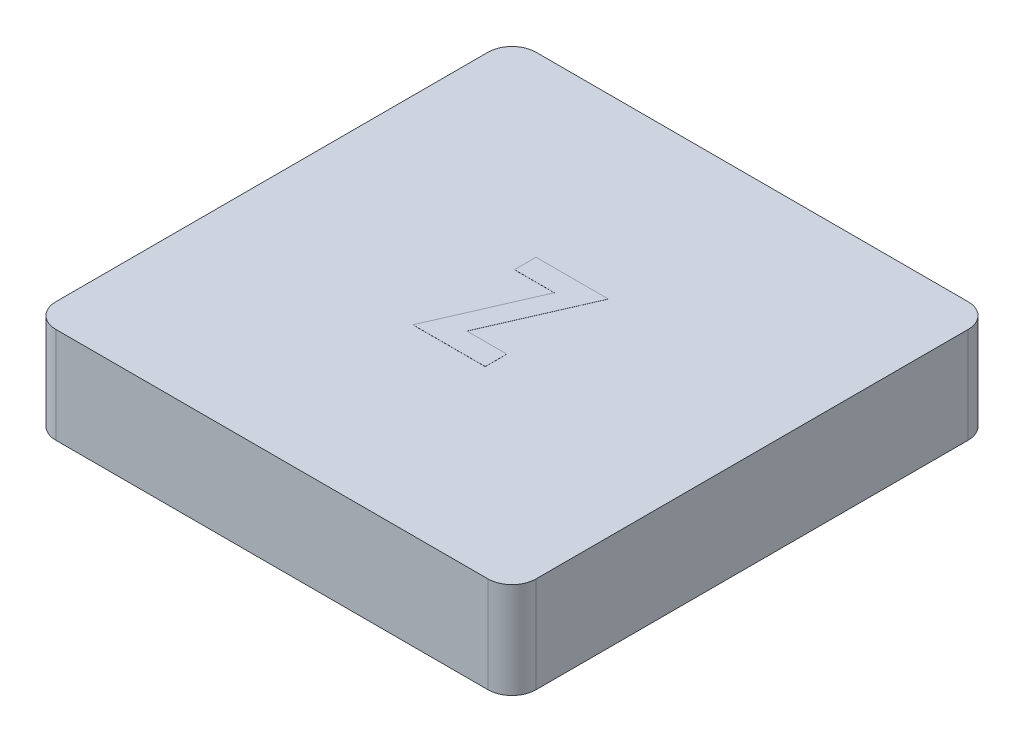
ISO-10303-21;
HEADER;
FILE_DESCRIPTION(('STEP AP214'),'2;1');
FILE_NAME('part.step','',(''),(''),'','','');
FILE_SCHEMA(('AUTOMOTIVE_DESIGN { 1 0 10303 214 1 1 1 1 }'));
ENDSEC;
DATA;
#1=APPLICATION_CONTEXT('core data for automotive mechanical design processes');
#2=APPLICATION_PROTOCOL_DEFINITION('international standard','automotive_design',2000,#1);
#3=PRODUCT_CONTEXT('',#1,'mechanical');
#4=PRODUCT('Part','Part','',(#3));
#5=PRODUCT_RELATED_PRODUCT_CATEGORY('part','',(#4));
#6=PRODUCT_DEFINITION_FORMATION('','',#4);
#7=PRODUCT_DEFINITION_CONTEXT('part definition',#1,'design');
#8=PRODUCT_DEFINITION('design','',#6,#7);
#9=PRODUCT_DEFINITION_SHAPE('','',#8);
#10=(LENGTH_UNIT() NAMED_UNIT(*) SI_UNIT(.MILLI.,.METRE.));
#11=(NAMED_UNIT(*) PLANE_ANGLE_UNIT() SI_UNIT($,.RADIAN.));
#12=(NAMED_UNIT(*) SI_UNIT($,.STERADIAN.) SOLID_ANGLE_UNIT());
#13=UNCERTAINTY_MEASURE_WITH_UNIT(LENGTH_MEASURE(1.E-05),#10,'distance_accuracy_value','');
#14=(GEOMETRIC_REPRESENTATION_CONTEXT(3) GLOBAL_UNCERTAINTY_ASSIGNED_CONTEXT((#13)) GLOBAL_UNIT_ASSIGNED_CONTEXT((#10,
#11,#12)) REPRESENTATION_CONTEXT('',''));
#15=CARTESIAN_POINT('',(0.,0.,0.));
#16=DIRECTION('',(0.,0.,1.));
#17=DIRECTION('',(1.,0.,0.));
#18=AXIS2_PLACEMENT_3D('',#15,#16,#17);
#19=CARTESIAN_POINT('',(0.,2.54,-12.7));
#20=DIRECTION('',(1.,0.,0.));
#21=DIRECTION('',(0.,0.,-1.));
#22=AXIS2_PLACEMENT_3D('',#19,#20,#21);
#23=PLANE('',#22);
#24=DIRECTION('',(0.,0.,1.));
#25=VECTOR('',#24,1.);
#26=CARTESIAN_POINT('',(0.,2.54,-12.7));
#27=LINE('',#26,#25);
#28=CARTESIAN_POINT('',(0.,2.54,-12.065));
#29=VERTEX_POINT('',#28);
#30=CARTESIAN_POINT('',(0.,2.54,-0.635));
#31=VERTEX_POINT('',#30);
#32=EDGE_CURVE('E280',#29,#31,#27,.T.);
#33=ORIENTED_EDGE('',*,*,#32,.F.);
#34=DIRECTION('',(0.,-1.,0.));
#35=VECTOR('',#34,1.);
#36=CARTESIAN_POINT('',(0.,2.54,-12.065));
#37=LINE('',#36,#35);
#38=CARTESIAN_POINT('',(0.,0.,-12.065));
#39=VERTEX_POINT('',#38);
#40=EDGE_CURVE('E305',#29,#39,#37,.T.);
#41=ORIENTED_EDGE('',*,*,#40,.T.);
#42=DIRECTION('',(0.,0.,1.));
#43=VECTOR('',#42,1.);
#44=CARTESIAN_POINT('',(0.,0.,-12.7));
#45=LINE('',#44,#43);
#46=CARTESIAN_POINT('',(0.,0.,-0.635));
#47=VERTEX_POINT('',#46);
#48=EDGE_CURVE('E260',#39,#47,#45,.T.);
#49=ORIENTED_EDGE('',*,*,#48,.T.);
#50=DIRECTION('',(0.,-1.,0.));
#51=VECTOR('',#50,1.);
#52=CARTESIAN_POINT('',(0.,2.54,-0.635));
#53=LINE('',#52,#51);
#54=EDGE_CURVE('E293',#47,#31,#53,.F.);
#55=ORIENTED_EDGE('',*,*,#54,.T.);
#56=EDGE_LOOP('',(#33,#41,#49,#55));
#57=FACE_BOUND('',#56,.T.);
#58=ADVANCED_FACE('F33',(#57),#23,.F.);
#59=CARTESIAN_POINT('',(0.,2.54,0.));
#60=DIRECTION('',(0.,0.,-1.));
#61=DIRECTION('',(-1.,0.,0.));
#62=AXIS2_PLACEMENT_3D('',#59,#60,#61);
#63=PLANE('',#62);
#64=DIRECTION('',(1.,0.,0.));
#65=VECTOR('',#64,1.);
#66=CARTESIAN_POINT('',(0.,0.,0.));
#67=LINE('',#66,#65);
#68=CARTESIAN_POINT('',(0.635,0.,0.));
#69=VERTEX_POINT('',#68);
#70=CARTESIAN_POINT('',(12.065,0.,0.));
#71=VERTEX_POINT('',#70);
#72=EDGE_CURVE('E296',#69,#71,#67,.T.);
#73=ORIENTED_EDGE('',*,*,#72,.T.);
#74=DIRECTION('',(0.,-1.,0.));
#75=VECTOR('',#74,1.);
#76=CARTESIAN_POINT('',(12.065,2.54,0.));
#77=LINE('',#76,#75);
#78=CARTESIAN_POINT('',(12.065,2.54,0.));
#79=VERTEX_POINT('',#78);
#80=EDGE_CURVE('E41',#71,#79,#77,.F.);
#81=ORIENTED_EDGE('',*,*,#80,.T.);
#82=DIRECTION('',(1.,0.,0.));
#83=VECTOR('',#82,1.);
#84=CARTESIAN_POINT('',(0.,2.54,0.));
#85=LINE('',#84,#83);
#86=CARTESIAN_POINT('',(0.635,2.54,0.));
#87=VERTEX_POINT('',#86);
#88=EDGE_CURVE('E283',#87,#79,#85,.T.);
#89=ORIENTED_EDGE('',*,*,#88,.F.);
#90=DIRECTION('',(0.,-1.,0.));
#91=VECTOR('',#90,1.);
#92=CARTESIAN_POINT('',(0.635,2.54,0.));
#93=LINE('',#92,#91);
#94=EDGE_CURVE('E334',#87,#69,#93,.T.);
#95=ORIENTED_EDGE('',*,*,#94,.T.);
#96=EDGE_LOOP('',(#73,#81,#89,#95));
#97=FACE_BOUND('',#96,.T.);
#98=ADVANCED_FACE('F339',(#97),#63,.F.);
#99=CARTESIAN_POINT('',(12.7,2.54,0.));
#100=DIRECTION('',(-1.,0.,0.));
#101=DIRECTION('',(0.,0.,1.));
#102=AXIS2_PLACEMENT_3D('',#99,#100,#101);
#103=PLANE('',#102);
#104=DIRECTION('',(0.,0.,-1.));
#105=VECTOR('',#104,1.);
#106=CARTESIAN_POINT('',(12.7,0.,0.));
#107=LINE('',#106,#105);
#108=CARTESIAN_POINT('',(12.7,0.,-0.635));
#109=VERTEX_POINT('',#108);
#110=CARTESIAN_POINT('',(12.7,0.,-12.065));
#111=VERTEX_POINT('',#110);
#112=EDGE_CURVE('E299',#109,#111,#107,.T.);
#113=ORIENTED_EDGE('',*,*,#112,.T.);
#114=DIRECTION('',(0.,-1.,0.));
#115=VECTOR('',#114,1.);
#116=CARTESIAN_POINT('',(12.7,2.54,-12.065));
#117=LINE('',#116,#115);
#118=CARTESIAN_POINT('',(12.7,2.54,-12.065));
#119=VERTEX_POINT('',#118);
#120=EDGE_CURVE('E332',#111,#119,#117,.F.);
#121=ORIENTED_EDGE('',*,*,#120,.T.);
#122=DIRECTION('',(0.,0.,-1.));
#123=VECTOR('',#122,1.);
#124=CARTESIAN_POINT('',(12.7,2.54,0.));
#125=LINE('',#124,#123);
#126=CARTESIAN_POINT('',(12.7,2.54,-0.635));
#127=VERTEX_POINT('',#126);
#128=EDGE_CURVE('E287',#127,#119,#125,.T.);
#129=ORIENTED_EDGE('',*,*,#128,.F.);
#130=DIRECTION('',(0.,-1.,0.));
#131=VECTOR('',#130,1.);
#132=CARTESIAN_POINT('',(12.7,2.54,-0.635));
#133=LINE('',#132,#131);
#134=EDGE_CURVE('E329',#127,#109,#133,.T.);
#135=ORIENTED_EDGE('',*,*,#134,.T.);
#136=EDGE_LOOP('',(#113,#121,#129,#135));
#137=FACE_BOUND('',#136,.T.);
#138=ADVANCED_FACE('F352',(#137),#103,.F.);
#139=CARTESIAN_POINT('',(12.7,2.54,-12.7));
#140=DIRECTION('',(0.,0.,1.));
#141=DIRECTION('',(1.,0.,0.));
#142=AXIS2_PLACEMENT_3D('',#139,#140,#141);
#143=PLANE('',#142);
#144=DIRECTION('',(-1.,0.,0.));
#145=VECTOR('',#144,1.);
#146=CARTESIAN_POINT('',(12.7,0.,-12.7));
#147=LINE('',#146,#145);
#148=CARTESIAN_POINT('',(12.065,0.,-12.7));
#149=VERTEX_POINT('',#148);
#150=CARTESIAN_POINT('',(0.634999999999995,0.,-12.7));
#151=VERTEX_POINT('',#150);
#152=EDGE_CURVE('E284',#149,#151,#147,.T.);
#153=ORIENTED_EDGE('',*,*,#152,.T.);
#154=DIRECTION('',(0.,-1.,0.));
#155=VECTOR('',#154,1.);
#156=CARTESIAN_POINT('',(0.634999999999995,2.54,-12.7));
#157=LINE('',#156,#155);
#158=CARTESIAN_POINT('',(0.634999999999995,2.54,-12.7));
#159=VERTEX_POINT('',#158);
#160=EDGE_CURVE('E319',#151,#159,#157,.F.);
#161=ORIENTED_EDGE('',*,*,#160,.T.);
#162=DIRECTION('',(-1.,0.,0.));
#163=VECTOR('',#162,1.);
#164=CARTESIAN_POINT('',(12.7,2.54,-12.7));
#165=LINE('',#164,#163);
#166=CARTESIAN_POINT('',(12.065,2.54,-12.7));
#167=VERTEX_POINT('',#166);
#168=EDGE_CURVE('E290',#167,#159,#165,.T.);
#169=ORIENTED_EDGE('',*,*,#168,.F.);
#170=DIRECTION('',(0.,-1.,0.));
#171=VECTOR('',#170,1.);
#172=CARTESIAN_POINT('',(12.065,2.54,-12.7));
#173=LINE('',#172,#171);
#174=EDGE_CURVE('E316',#167,#149,#173,.T.);
#175=ORIENTED_EDGE('',*,*,#174,.T.);
#176=EDGE_LOOP('',(#153,#161,#169,#175));
#177=FACE_BOUND('',#176,.T.);
#178=ADVANCED_FACE('F364',(#177),#143,.F.);
#179=CARTESIAN_POINT('',(0.,2.54,0.));
#180=DIRECTION('',(0.,1.,0.));
#181=DIRECTION('',(0.,0.,1.));
#182=AXIS2_PLACEMENT_3D('',#179,#180,#181);
#183=PLANE('',#182);
#184=DIRECTION('',(0.,0.,-1.));
#185=VECTOR('',#184,1.);
#186=CARTESIAN_POINT('',(5.33432564102564,2.54,-7.4311282051282));
#187=LINE('',#186,#185);
#188=CARTESIAN_POINT('',(5.33432564102564,2.54,-7.4311282051282));
#189=VERTEX_POINT('',#188);
#190=CARTESIAN_POINT('',(5.33432564102564,2.54,-8.001));
#191=VERTEX_POINT('',#190);
#192=EDGE_CURVE('E212',#189,#191,#187,.T.);
#193=ORIENTED_EDGE('',*,*,#192,.T.);
#194=DIRECTION('',(1.,0.,0.));
#195=VECTOR('',#194,1.);
#196=CARTESIAN_POINT('',(5.33432564102564,2.54,-8.001));
#197=LINE('',#196,#195);
#198=CARTESIAN_POINT('',(7.24746666666666,2.54,-8.001));
#199=VERTEX_POINT('',#198);
#200=EDGE_CURVE('E175',#191,#199,#197,.T.);
#201=ORIENTED_EDGE('',*,*,#200,.T.);
#202=DIRECTION('',(-0.400067481501263,0.,0.916485684691931));
#203=VECTOR('',#202,1.);
#204=CARTESIAN_POINT('',(7.24746666666666,2.54,-8.001));
#205=LINE('',#204,#203);
#206=CARTESIAN_POINT('',(6.11026714743589,2.54,-5.39587179487179));
#207=VERTEX_POINT('',#206);
#208=EDGE_CURVE('E215',#199,#207,#205,.T.);
#209=ORIENTED_EDGE('',*,*,#208,.T.);
#210=DIRECTION('',(1.,0.,0.));
#211=VECTOR('',#210,1.);
#212=CARTESIAN_POINT('',(6.11026714743589,2.54,-5.39587179487179));
#213=LINE('',#212,#211);
#214=CARTESIAN_POINT('',(7.16605641025641,2.54,-5.39587179487179));
#215=VERTEX_POINT('',#214);
#216=EDGE_CURVE('E217',#207,#215,#213,.T.);
#217=ORIENTED_EDGE('',*,*,#216,.T.);
#218=DIRECTION('',(0.,0.,1.));
#219=VECTOR('',#218,1.);
#220=CARTESIAN_POINT('',(7.16605641025641,2.54,-5.39587179487179));
#221=LINE('',#220,#219);
#222=CARTESIAN_POINT('',(7.16605641025641,2.54,-4.826));
#223=VERTEX_POINT('',#222);
#224=EDGE_CURVE('E219',#215,#223,#221,.T.);
#225=ORIENTED_EDGE('',*,*,#224,.T.);
#226=DIRECTION('',(-1.,0.,0.));
#227=VECTOR('',#226,1.);
#228=CARTESIAN_POINT('',(7.16605641025641,2.54,-4.826));
#229=LINE('',#228,#227);
#230=CARTESIAN_POINT('',(5.25291538461538,2.54,-4.826));
#231=VERTEX_POINT('',#230);
#232=EDGE_CURVE('E221',#223,#231,#229,.T.);
#233=ORIENTED_EDGE('',*,*,#232,.T.);
#234=DIRECTION('',(0.400255395350612,0.,-0.916403632954783));
#235=VECTOR('',#234,1.);
#236=CARTESIAN_POINT('',(5.25291538461538,2.54,-4.826));
#237=LINE('',#236,#235);
#238=CARTESIAN_POINT('',(6.39075092147435,2.54,-7.4311282051282));
#239=VERTEX_POINT('',#238);
#240=EDGE_CURVE('E53',#231,#239,#237,.T.);
#241=ORIENTED_EDGE('',*,*,#240,.T.);
#242=DIRECTION('',(-1.,0.,0.));
#243=VECTOR('',#242,1.);
#244=CARTESIAN_POINT('',(6.39075092147435,2.54,-7.4311282051282));
#245=LINE('',#244,#243);
#246=EDGE_CURVE('E48',#239,#189,#245,.T.);
#247=ORIENTED_EDGE('',*,*,#246,.T.);
#248=EDGE_LOOP('',(#193,#201,#209,#217,#225,#233,#241,#247));
#249=FACE_BOUND('',#248,.T.);
#250=ORIENTED_EDGE('',*,*,#168,.T.);
#251=CARTESIAN_POINT('',(0.634999999999995,2.54,-12.065));
#252=DIRECTION('',(0.,1.,0.));
#253=DIRECTION('',(0.,0.,1.));
#254=AXIS2_PLACEMENT_3D('',#251,#252,#253);
#255=CIRCLE('',#254,0.635);
#256=EDGE_CURVE('E327',#159,#29,#255,.T.);
#257=ORIENTED_EDGE('',*,*,#256,.T.);
#258=ORIENTED_EDGE('',*,*,#32,.T.);
#259=CARTESIAN_POINT('',(0.635,2.54,-0.635));
#260=DIRECTION('',(0.,1.,0.));
#261=DIRECTION('',(0.,0.,1.));
#262=AXIS2_PLACEMENT_3D('',#259,#260,#261);
#263=CIRCLE('',#262,0.635);
#264=EDGE_CURVE('E321',#31,#87,#263,.T.);
#265=ORIENTED_EDGE('',*,*,#264,.T.);
#266=ORIENTED_EDGE('',*,*,#88,.T.);
#267=CARTESIAN_POINT('',(12.065,2.54,-0.635));
#268=DIRECTION('',(0.,1.,0.));
#269=DIRECTION('',(0.,0.,1.));
#270=AXIS2_PLACEMENT_3D('',#267,#268,#269);
#271=CIRCLE('',#270,0.635);
#272=EDGE_CURVE('E323',#79,#127,#271,.T.);
#273=ORIENTED_EDGE('',*,*,#272,.T.);
#274=ORIENTED_EDGE('',*,*,#128,.T.);
#275=CARTESIAN_POINT('',(12.065,2.54,-12.065));
#276=DIRECTION('',(0.,1.,0.));
#277=DIRECTION('',(0.,0.,1.));
#278=AXIS2_PLACEMENT_3D('',#275,#276,#277);
#279=CIRCLE('',#278,0.635);
#280=EDGE_CURVE('E325',#119,#167,#279,.T.);
#281=ORIENTED_EDGE('',*,*,#280,.T.);
#282=EDGE_LOOP('',(#250,#257,#258,#265,#266,#273,#274,#281));
#283=FACE_BOUND('',#282,.T.);
#284=ADVANCED_FACE('F345',(#249,#283),#183,.T.);
#285=CARTESIAN_POINT('',(0.,0.,0.));
#286=DIRECTION('',(0.,1.,0.));
#287=DIRECTION('',(0.,0.,1.));
#288=AXIS2_PLACEMENT_3D('',#285,#286,#287);
#289=PLANE('',#288);
#290=DIRECTION('',(-1.,0.,0.));
#291=VECTOR('',#290,1.);
#292=CARTESIAN_POINT('',(12.7,0.,-12.065));
#293=LINE('',#292,#291);
#294=CARTESIAN_POINT('',(12.065,0.,-12.065));
#295=VERTEX_POINT('',#294);
#296=CARTESIAN_POINT('',(0.634999999999995,0.,-12.065));
#297=VERTEX_POINT('',#296);
#298=EDGE_CURVE('E248',#295,#297,#293,.T.);
#299=ORIENTED_EDGE('',*,*,#298,.T.);
#300=DIRECTION('',(0.,0.,1.));
#301=VECTOR('',#300,1.);
#302=CARTESIAN_POINT('',(0.634999999999995,0.,-12.7));
#303=LINE('',#302,#301);
#304=CARTESIAN_POINT('',(0.635,0.,-0.635));
#305=VERTEX_POINT('',#304);
#306=EDGE_CURVE('E243',#297,#305,#303,.T.);
#307=ORIENTED_EDGE('',*,*,#306,.T.);
#308=DIRECTION('',(1.,0.,0.));
#309=VECTOR('',#308,1.);
#310=CARTESIAN_POINT('',(0.,0.,-0.635));
#311=LINE('',#310,#309);
#312=CARTESIAN_POINT('',(12.065,0.,-0.635));
#313=VERTEX_POINT('',#312);
#314=EDGE_CURVE('E272',#305,#313,#311,.T.);
#315=ORIENTED_EDGE('',*,*,#314,.T.);
#316=DIRECTION('',(0.,0.,-1.));
#317=VECTOR('',#316,1.);
#318=CARTESIAN_POINT('',(12.065,0.,0.));
#319=LINE('',#318,#317);
#320=EDGE_CURVE('E275',#313,#295,#319,.T.);
#321=ORIENTED_EDGE('',*,*,#320,.T.);
#322=EDGE_LOOP('',(#299,#307,#315,#321));
#323=FACE_BOUND('',#322,.T.);
#324=ORIENTED_EDGE('',*,*,#48,.F.);
#325=CARTESIAN_POINT('',(0.634999999999995,0.,-12.065));
#326=DIRECTION('',(0.,1.,0.));
#327=DIRECTION('',(0.,0.,1.));
#328=AXIS2_PLACEMENT_3D('',#325,#326,#327);
#329=CIRCLE('',#328,0.635);
#330=EDGE_CURVE('E314',#39,#151,#329,.F.);
#331=ORIENTED_EDGE('',*,*,#330,.T.);
#332=ORIENTED_EDGE('',*,*,#152,.F.);
#333=CARTESIAN_POINT('',(12.065,0.,-12.065));
#334=DIRECTION('',(0.,1.,0.));
#335=DIRECTION('',(0.,0.,1.));
#336=AXIS2_PLACEMENT_3D('',#333,#334,#335);
#337=CIRCLE('',#336,0.635);
#338=EDGE_CURVE('E312',#149,#111,#337,.F.);
#339=ORIENTED_EDGE('',*,*,#338,.T.);
#340=ORIENTED_EDGE('',*,*,#112,.F.);
#341=CARTESIAN_POINT('',(12.065,0.,-0.635));
#342=DIRECTION('',(0.,1.,0.));
#343=DIRECTION('',(0.,0.,1.));
#344=AXIS2_PLACEMENT_3D('',#341,#342,#343);
#345=CIRCLE('',#344,0.635);
#346=EDGE_CURVE('E310',#109,#71,#345,.F.);
#347=ORIENTED_EDGE('',*,*,#346,.T.);
#348=ORIENTED_EDGE('',*,*,#72,.F.);
#349=CARTESIAN_POINT('',(0.635,0.,-0.635));
#350=DIRECTION('',(0.,1.,0.));
#351=DIRECTION('',(0.,0.,1.));
#352=AXIS2_PLACEMENT_3D('',#349,#350,#351);
#353=CIRCLE('',#352,0.635);
#354=EDGE_CURVE('E308',#69,#47,#353,.F.);
#355=ORIENTED_EDGE('',*,*,#354,.T.);
#356=EDGE_LOOP('',(#324,#331,#332,#339,#340,#347,#348,#355));
#357=FACE_BOUND('',#356,.T.);
#358=ADVANCED_FACE('F356',(#323,#357),#289,.F.);
#359=CARTESIAN_POINT('',(0.634999999999995,2.54,-12.065));
#360=DIRECTION('',(0.,-1.,0.));
#361=DIRECTION('',(0.,0.,-1.));
#362=AXIS2_PLACEMENT_3D('',#359,#360,#361);
#363=CYLINDRICAL_SURFACE('',#362,0.635);
#364=ORIENTED_EDGE('',*,*,#256,.F.);
#365=ORIENTED_EDGE('',*,*,#160,.F.);
#366=ORIENTED_EDGE('',*,*,#330,.F.);
#367=ORIENTED_EDGE('',*,*,#40,.F.);
#368=EDGE_LOOP('',(#364,#365,#366,#367));
#369=FACE_BOUND('',#368,.T.);
#370=ADVANCED_FACE('F370',(#369),#363,.T.);
#371=CARTESIAN_POINT('',(12.065,2.54,-12.065));
#372=DIRECTION('',(0.,-1.,0.));
#373=DIRECTION('',(0.,0.,-1.));
#374=AXIS2_PLACEMENT_3D('',#371,#372,#373);
#375=CYLINDRICAL_SURFACE('',#374,0.635);
#376=ORIENTED_EDGE('',*,*,#280,.F.);
#377=ORIENTED_EDGE('',*,*,#120,.F.);
#378=ORIENTED_EDGE('',*,*,#338,.F.);
#379=ORIENTED_EDGE('',*,*,#174,.F.);
#380=EDGE_LOOP('',(#376,#377,#378,#379));
#381=FACE_BOUND('',#380,.T.);
#382=ADVANCED_FACE('F361',(#381),#375,.T.);
#383=CARTESIAN_POINT('',(12.065,2.54,-0.635));
#384=DIRECTION('',(0.,-1.,0.));
#385=DIRECTION('',(0.,0.,-1.));
#386=AXIS2_PLACEMENT_3D('',#383,#384,#385);
#387=CYLINDRICAL_SURFACE('',#386,0.635);
#388=ORIENTED_EDGE('',*,*,#272,.F.);
#389=ORIENTED_EDGE('',*,*,#80,.F.);
#390=ORIENTED_EDGE('',*,*,#346,.F.);
#391=ORIENTED_EDGE('',*,*,#134,.F.);
#392=EDGE_LOOP('',(#388,#389,#390,#391));
#393=FACE_BOUND('',#392,.T.);
#394=ADVANCED_FACE('F349',(#393),#387,.T.);
#395=CARTESIAN_POINT('',(0.635,2.54,-0.635));
#396=DIRECTION('',(0.,-1.,0.));
#397=DIRECTION('',(0.,0.,-1.));
#398=AXIS2_PLACEMENT_3D('',#395,#396,#397);
#399=CYLINDRICAL_SURFACE('',#398,0.635);
#400=ORIENTED_EDGE('',*,*,#264,.F.);
#401=ORIENTED_EDGE('',*,*,#54,.F.);
#402=ORIENTED_EDGE('',*,*,#354,.F.);
#403=ORIENTED_EDGE('',*,*,#94,.F.);
#404=EDGE_LOOP('',(#400,#401,#402,#403));
#405=FACE_BOUND('',#404,.T.);
#406=ADVANCED_FACE('F35',(#405),#399,.T.);
#407=CARTESIAN_POINT('',(0.634999999999995,2.54,-12.7));
#408=DIRECTION('',(1.,0.,0.));
#409=DIRECTION('',(0.,0.,-1.));
#410=AXIS2_PLACEMENT_3D('',#407,#408,#409);
#411=PLANE('',#410);
#412=DIRECTION('',(0.,0.,1.));
#413=VECTOR('',#412,1.);
#414=CARTESIAN_POINT('',(0.634999999999995,1.905,-12.7));
#415=LINE('',#414,#413);
#416=CARTESIAN_POINT('',(0.634999999999995,1.905,-12.065));
#417=VERTEX_POINT('',#416);
#418=CARTESIAN_POINT('',(0.635,1.905,-0.635));
#419=VERTEX_POINT('',#418);
#420=EDGE_CURVE('E244',#417,#419,#415,.T.);
#421=ORIENTED_EDGE('',*,*,#420,.T.);
#422=DIRECTION('',(0.,1.,0.));
#423=VECTOR('',#422,1.);
#424=CARTESIAN_POINT('',(0.635,2.54,-0.635));
#425=LINE('',#424,#423);
#426=EDGE_CURVE('E253',#305,#419,#425,.T.);
#427=ORIENTED_EDGE('',*,*,#426,.F.);
#428=ORIENTED_EDGE('',*,*,#306,.F.);
#429=DIRECTION('',(0.,1.,0.));
#430=VECTOR('',#429,1.);
#431=CARTESIAN_POINT('',(0.634999999999995,2.54,-12.065));
#432=LINE('',#431,#430);
#433=EDGE_CURVE('E249',#297,#417,#432,.T.);
#434=ORIENTED_EDGE('',*,*,#433,.T.);
#435=EDGE_LOOP('',(#421,#427,#428,#434));
#436=FACE_BOUND('',#435,.T.);
#437=ADVANCED_FACE('F375',(#436),#411,.T.);
#438=CARTESIAN_POINT('',(0.,2.54,-0.635));
#439=DIRECTION('',(0.,0.,-1.));
#440=DIRECTION('',(-1.,0.,0.));
#441=AXIS2_PLACEMENT_3D('',#438,#439,#440);
#442=PLANE('',#441);
#443=ORIENTED_EDGE('',*,*,#314,.F.);
#444=ORIENTED_EDGE('',*,*,#426,.T.);
#445=DIRECTION('',(1.,0.,0.));
#446=VECTOR('',#445,1.);
#447=CARTESIAN_POINT('',(0.,1.905,-0.635));
#448=LINE('',#447,#446);
#449=CARTESIAN_POINT('',(12.065,1.905,-0.635));
#450=VERTEX_POINT('',#449);
#451=EDGE_CURVE('E247',#419,#450,#448,.T.);
#452=ORIENTED_EDGE('',*,*,#451,.T.);
#453=DIRECTION('',(0.,1.,0.));
#454=VECTOR('',#453,1.);
#455=CARTESIAN_POINT('',(12.065,2.54,-0.635));
#456=LINE('',#455,#454);
#457=EDGE_CURVE('E257',#313,#450,#456,.T.);
#458=ORIENTED_EDGE('',*,*,#457,.F.);
#459=EDGE_LOOP('',(#443,#444,#452,#458));
#460=FACE_BOUND('',#459,.T.);
#461=ADVANCED_FACE('F380',(#460),#442,.T.);
#462=CARTESIAN_POINT('',(12.065,2.54,0.));
#463=DIRECTION('',(-1.,0.,0.));
#464=DIRECTION('',(0.,0.,1.));
#465=AXIS2_PLACEMENT_3D('',#462,#463,#464);
#466=PLANE('',#465);
#467=ORIENTED_EDGE('',*,*,#320,.F.);
#468=ORIENTED_EDGE('',*,*,#457,.T.);
#469=DIRECTION('',(0.,0.,-1.));
#470=VECTOR('',#469,1.);
#471=CARTESIAN_POINT('',(12.065,1.905,0.));
#472=LINE('',#471,#470);
#473=CARTESIAN_POINT('',(12.065,1.905,-12.065));
#474=VERTEX_POINT('',#473);
#475=EDGE_CURVE('E263',#450,#474,#472,.T.);
#476=ORIENTED_EDGE('',*,*,#475,.T.);
#477=DIRECTION('',(0.,1.,0.));
#478=VECTOR('',#477,1.);
#479=CARTESIAN_POINT('',(12.065,2.54,-12.065));
#480=LINE('',#479,#478);
#481=EDGE_CURVE('E252',#295,#474,#480,.T.);
#482=ORIENTED_EDGE('',*,*,#481,.F.);
#483=EDGE_LOOP('',(#467,#468,#476,#482));
#484=FACE_BOUND('',#483,.T.);
#485=ADVANCED_FACE('F433',(#484),#466,.T.);
#486=CARTESIAN_POINT('',(12.7,2.54,-12.065));
#487=DIRECTION('',(0.,0.,1.));
#488=DIRECTION('',(1.,0.,0.));
#489=AXIS2_PLACEMENT_3D('',#486,#487,#488);
#490=PLANE('',#489);
#491=ORIENTED_EDGE('',*,*,#298,.F.);
#492=ORIENTED_EDGE('',*,*,#481,.T.);
#493=DIRECTION('',(-1.,0.,0.));
#494=VECTOR('',#493,1.);
#495=CARTESIAN_POINT('',(12.7,1.905,-12.065));
#496=LINE('',#495,#494);
#497=EDGE_CURVE('E256',#474,#417,#496,.T.);
#498=ORIENTED_EDGE('',*,*,#497,.T.);
#499=ORIENTED_EDGE('',*,*,#433,.F.);
#500=EDGE_LOOP('',(#491,#492,#498,#499));
#501=FACE_BOUND('',#500,.T.);
#502=ADVANCED_FACE('F443',(#501),#490,.T.);
#503=CARTESIAN_POINT('',(0.,1.905,0.));
#504=DIRECTION('',(0.,1.,0.));
#505=DIRECTION('',(0.,0.,1.));
#506=AXIS2_PLACEMENT_3D('',#503,#504,#505);
#507=PLANE('',#506);
#508=CARTESIAN_POINT('',(6.34999999999999,1.905,-6.35));
#509=DIRECTION('',(0.,1.,0.));
#510=DIRECTION('',(0.,0.,1.));
#511=AXIS2_PLACEMENT_3D('',#508,#509,#510);
#512=CIRCLE('',#511,2.54);
#513=CARTESIAN_POINT('',(6.34999999999999,1.905,-3.81));
#514=VERTEX_POINT('',#513);
#515=EDGE_CURVE('E11',#514,#514,#512,.F.);
#516=ORIENTED_EDGE('',*,*,#515,.F.);
#517=EDGE_LOOP('',(#516));
#518=FACE_BOUND('',#517,.T.);
#519=ORIENTED_EDGE('',*,*,#497,.F.);
#520=ORIENTED_EDGE('',*,*,#475,.F.);
#521=ORIENTED_EDGE('',*,*,#451,.F.);
#522=ORIENTED_EDGE('',*,*,#420,.F.);
#523=EDGE_LOOP('',(#519,#520,#521,#522));
#524=FACE_BOUND('',#523,.T.);
#525=ADVANCED_FACE('F453',(#518,#524),#507,.F.);
#526=CARTESIAN_POINT('',(6.34999999999999,-7.18420489685532,-6.35));
#527=DIRECTION('',(0.,1.,0.));
#528=DIRECTION('',(0.,0.,1.));
#529=AXIS2_PLACEMENT_3D('',#526,#527,#528);
#530=CYLINDRICAL_SURFACE('',#529,2.54);
#531=CARTESIAN_POINT('',(6.34999999999999,0.,-6.35));
#532=DIRECTION('',(0.,1.,0.));
#533=DIRECTION('',(0.,0.,1.));
#534=AXIS2_PLACEMENT_3D('',#531,#532,#533);
#535=CIRCLE('',#534,2.54);
#536=CARTESIAN_POINT('',(6.34999999999999,0.,-3.81));
#537=VERTEX_POINT('',#536);
#538=EDGE_CURVE('E225',#537,#537,#535,.T.);
#539=CARTESIAN_POINT('',(6.34999999999999,0.,-3.81));
#540=CARTESIAN_POINT('',(6.34999999999999,0.0198437499999991,-3.81));
#541=CARTESIAN_POINT('',(6.34999999999999,0.0396874999999989,-3.81));
#542=CARTESIAN_POINT('',(6.34999999999999,0.079374999999999,-3.81));
#543=CARTESIAN_POINT('',(6.34999999999999,0.0992187499999992,-3.81));
#544=CARTESIAN_POINT('',(6.34999999999999,0.138906249999999,-3.81));
#545=CARTESIAN_POINT('',(6.34999999999999,0.158749999999999,-3.81));
#546=CARTESIAN_POINT('',(6.34999999999999,0.198437499999999,-3.81));
#547=CARTESIAN_POINT('',(6.34999999999999,0.218281249999999,-3.81));
#548=CARTESIAN_POINT('',(6.34999999999999,0.25796875,-3.81));
#549=CARTESIAN_POINT('',(6.34999999999999,0.277812499999999,-3.81));
#550=CARTESIAN_POINT('',(6.34999999999999,0.317499999999999,-3.81));
#551=CARTESIAN_POINT('',(6.34999999999999,0.337343749999999,-3.81));
#552=CARTESIAN_POINT('',(6.34999999999999,0.377031249999999,-3.81));
#553=CARTESIAN_POINT('',(6.34999999999999,0.396874999999999,-3.81));
#554=CARTESIAN_POINT('',(6.34999999999999,0.436562499999999,-3.81));
#555=CARTESIAN_POINT('',(6.34999999999999,0.456406249999999,-3.81));
#556=CARTESIAN_POINT('',(6.34999999999999,0.496093749999999,-3.81));
#557=CARTESIAN_POINT('',(6.34999999999999,0.515937499999999,-3.81));
#558=CARTESIAN_POINT('',(6.34999999999999,0.555624999999999,-3.81));
#559=CARTESIAN_POINT('',(6.34999999999999,0.575468749999999,-3.81));
#560=CARTESIAN_POINT('',(6.34999999999999,0.615156249999999,-3.81));
#561=CARTESIAN_POINT('',(6.34999999999999,0.634999999999999,-3.81));
#562=CARTESIAN_POINT('',(6.34999999999999,0.674687499999998,-3.81));
#563=CARTESIAN_POINT('',(6.34999999999999,0.694531249999998,-3.81));
#564=CARTESIAN_POINT('',(6.34999999999999,0.734218749999998,-3.81));
#565=CARTESIAN_POINT('',(6.34999999999999,0.754062499999998,-3.81));
#566=CARTESIAN_POINT('',(6.34999999999999,0.793749999999998,-3.81));
#567=CARTESIAN_POINT('',(6.34999999999999,0.813593749999999,-3.81));
#568=CARTESIAN_POINT('',(6.34999999999999,0.853281249999999,-3.81));
#569=CARTESIAN_POINT('',(6.34999999999999,0.873124999999999,-3.81));
#570=CARTESIAN_POINT('',(6.34999999999999,0.912812499999999,-3.81));
#571=CARTESIAN_POINT('',(6.34999999999999,0.932656249999999,-3.81));
#572=CARTESIAN_POINT('',(6.34999999999999,0.972343749999998,-3.81));
#573=CARTESIAN_POINT('',(6.34999999999999,0.992187499999998,-3.81));
#574=CARTESIAN_POINT('',(6.34999999999999,1.031875,-3.81));
#575=CARTESIAN_POINT('',(6.34999999999999,1.05171875,-3.81));
#576=CARTESIAN_POINT('',(6.34999999999999,1.09140625,-3.81));
#577=CARTESIAN_POINT('',(6.34999999999999,1.11125,-3.81));
#578=CARTESIAN_POINT('',(6.34999999999999,1.1509375,-3.81));
#579=CARTESIAN_POINT('',(6.34999999999999,1.17078125,-3.81));
#580=CARTESIAN_POINT('',(6.34999999999999,1.21046875,-3.81));
#581=CARTESIAN_POINT('',(6.34999999999999,1.2303125,-3.81));
#582=CARTESIAN_POINT('',(6.34999999999999,1.27,-3.81));
#583=CARTESIAN_POINT('',(6.34999999999999,1.28984375,-3.81));
#584=CARTESIAN_POINT('',(6.34999999999999,1.32953125,-3.81));
#585=CARTESIAN_POINT('',(6.34999999999999,1.349375,-3.81));
#586=CARTESIAN_POINT('',(6.34999999999999,1.3890625,-3.81));
#587=CARTESIAN_POINT('',(6.34999999999999,1.40890625,-3.81));
#588=CARTESIAN_POINT('',(6.34999999999999,1.44859375,-3.81));
#589=CARTESIAN_POINT('',(6.34999999999999,1.4684375,-3.81));
#590=CARTESIAN_POINT('',(6.34999999999999,1.508125,-3.81));
#591=CARTESIAN_POINT('',(6.34999999999999,1.52796875,-3.81));
#592=CARTESIAN_POINT('',(6.34999999999999,1.56765625,-3.81));
#593=CARTESIAN_POINT('',(6.34999999999999,1.5875,-3.81));
#594=CARTESIAN_POINT('',(6.34999999999999,1.6271875,-3.81));
#595=CARTESIAN_POINT('',(6.34999999999999,1.64703125,-3.81));
#596=CARTESIAN_POINT('',(6.34999999999999,1.68671875,-3.81));
#597=CARTESIAN_POINT('',(6.34999999999999,1.7065625,-3.81));
#598=CARTESIAN_POINT('',(6.34999999999999,1.74625,-3.81));
#599=CARTESIAN_POINT('',(6.34999999999999,1.76609375,-3.81));
#600=CARTESIAN_POINT('',(6.34999999999999,1.80578125,-3.81));
#601=CARTESIAN_POINT('',(6.34999999999999,1.825625,-3.81));
#602=CARTESIAN_POINT('',(6.34999999999999,1.8653125,-3.81));
#603=CARTESIAN_POINT('',(6.34999999999999,1.88515625,-3.81));
#604=CARTESIAN_POINT('',(6.34999999999999,1.905,-3.81));
#605=B_SPLINE_CURVE_WITH_KNOTS('',3,(#539,#540,#541,#542,#543,#544,#545,#546,#547,#548,#549,
#550,#551,#552,#553,#554,#555,#556,#557,#558,#559,#560,#561,#562,#563,#564,#565,#566,#567,#568,
#569,#570,#571,#572,#573,#574,#575,#576,#577,#578,#579,#580,#581,#582,#583,#584,#585,#586,#587,
#588,#589,#590,#591,#592,#593,#594,#595,#596,#597,#598,#599,#600,#601,#602,#603,#604),
.UNSPECIFIED.,.F.,.F.,(4,2,2,2,2,2,2,2,2,2,2,2,2,2,2,2,2,2,2,2,2,2,2,2,2,2,2,2,2,2,2,2,4),(0.,
0.0595312499999997,0.1190625,0.17859375,0.238125,0.29765625,0.3571875,0.41671875,0.47625,
0.53578125,0.5953125,0.654843749999999,0.714374999999999,0.773906249999999,0.8334375,0.89296875,
0.952499999999999,1.01203125,1.0715625,1.13109375,1.190625,1.25015625,1.3096875,1.36921875,
1.42875,1.48828125,1.5478125,1.60734375,1.666875,1.72640625,1.7859375,1.84546875,1.905),.UNSPECIFIED.);
#606=EDGE_CURVE('BSEAM463',#537,#514,#605,.T.);
#607=ORIENTED_EDGE('',*,*,#538,.T.);
#608=ORIENTED_EDGE('',*,*,#515,.T.);
#609=ORIENTED_EDGE('',*,*,#606,.T.);
#610=ORIENTED_EDGE('',*,*,#606,.F.);
#611=EDGE_LOOP('',(#607,#609,#608,#610));
#612=FACE_BOUND('',#611,.T.);
#613=ADVANCED_FACE('F463',(#612),#530,.T.);
#614=CARTESIAN_POINT('',(0.,0.,0.));
#615=DIRECTION('',(0.,1.,0.));
#616=DIRECTION('',(0.,0.,1.));
#617=AXIS2_PLACEMENT_3D('',#614,#615,#616);
#618=PLANE('',#617);
#619=ORIENTED_EDGE('',*,*,#538,.F.);
#620=EDGE_LOOP('',(#619));
#621=FACE_BOUND('',#620,.T.);
#622=ADVANCED_FACE('F473',(#621),#618,.F.);
#623=CARTESIAN_POINT('',(5.33432564102564,2.54254,-7.4311282051282));
#624=DIRECTION('',(-1.,0.,0.));
#625=DIRECTION('',(0.,0.,1.));
#626=AXIS2_PLACEMENT_3D('',#623,#624,#625);
#627=PLANE('',#626);
#628=ORIENTED_EDGE('',*,*,#192,.F.);
#629=DIRECTION('',(0.,-1.,0.));
#630=VECTOR('',#629,1.);
#631=CARTESIAN_POINT('',(5.33432564102564,2.54254,-7.4311282051282));
#632=LINE('',#631,#630);
#633=CARTESIAN_POINT('',(5.33432564102564,2.54254,-7.4311282051282));
#634=VERTEX_POINT('',#633);
#635=EDGE_CURVE('E194',#634,#189,#632,.T.);
#636=ORIENTED_EDGE('',*,*,#635,.F.);
#637=DIRECTION('',(0.,0.,-1.));
#638=VECTOR('',#637,1.);
#639=CARTESIAN_POINT('',(5.33432564102564,2.54254,-7.4311282051282));
#640=LINE('',#639,#638);
#641=CARTESIAN_POINT('',(5.33432564102564,2.54254,-8.001));
#642=VERTEX_POINT('',#641);
#643=EDGE_CURVE('E187',#634,#642,#640,.T.);
#644=ORIENTED_EDGE('',*,*,#643,.T.);
#645=DIRECTION('',(0.,-1.,0.));
#646=VECTOR('',#645,1.);
#647=CARTESIAN_POINT('',(5.33432564102564,2.54254,-8.001));
#648=LINE('',#647,#646);
#649=EDGE_CURVE('E170',#642,#191,#648,.T.);
#650=ORIENTED_EDGE('',*,*,#649,.T.);
#651=EDGE_LOOP('',(#628,#636,#644,#650));
#652=FACE_BOUND('',#651,.T.);
#653=ADVANCED_FACE('F193',(#652),#627,.T.);
#654=CARTESIAN_POINT('',(6.39075092147435,2.54254,-7.4311282051282));
#655=DIRECTION('',(0.,0.,1.));
#656=DIRECTION('',(1.,0.,0.));
#657=AXIS2_PLACEMENT_3D('',#654,#655,#656);
#658=PLANE('',#657);
#659=ORIENTED_EDGE('',*,*,#246,.F.);
#660=DIRECTION('',(0.,-1.,0.));
#661=VECTOR('',#660,1.);
#662=CARTESIAN_POINT('',(6.39075092147435,2.54254,-7.4311282051282));
#663=LINE('',#662,#661);
#664=CARTESIAN_POINT('',(6.39075092147435,2.54254,-7.4311282051282));
#665=VERTEX_POINT('',#664);
#666=EDGE_CURVE('E226',#665,#239,#663,.T.);
#667=ORIENTED_EDGE('',*,*,#666,.F.);
#668=DIRECTION('',(-1.,0.,0.));
#669=VECTOR('',#668,1.);
#670=CARTESIAN_POINT('',(6.39075092147435,2.54254,-7.4311282051282));
#671=LINE('',#670,#669);
#672=EDGE_CURVE('E180',#665,#634,#671,.T.);
#673=ORIENTED_EDGE('',*,*,#672,.T.);
#674=ORIENTED_EDGE('',*,*,#635,.T.);
#675=EDGE_LOOP('',(#659,#667,#673,#674));
#676=FACE_BOUND('',#675,.T.);
#677=ADVANCED_FACE('F500',(#676),#658,.T.);
#678=CARTESIAN_POINT('',(5.25291538461538,2.54254,-4.826));
#679=DIRECTION('',(-0.916403632954783,0.,-0.400255395350612));
#680=DIRECTION('',(-0.400255395350612,0.,0.916403632954783));
#681=AXIS2_PLACEMENT_3D('',#678,#679,#680);
#682=PLANE('',#681);
#683=ORIENTED_EDGE('',*,*,#240,.F.);
#684=DIRECTION('',(0.,-1.,0.));
#685=VECTOR('',#684,1.);
#686=CARTESIAN_POINT('',(5.25291538461538,2.54254,-4.826));
#687=LINE('',#686,#685);
#688=CARTESIAN_POINT('',(5.25291538461538,2.54254,-4.826));
#689=VERTEX_POINT('',#688);
#690=EDGE_CURVE('E228',#689,#231,#687,.T.);
#691=ORIENTED_EDGE('',*,*,#690,.F.);
#692=DIRECTION('',(0.400255395350612,0.,-0.916403632954783));
#693=VECTOR('',#692,1.);
#694=CARTESIAN_POINT('',(5.25291538461538,2.54254,-4.826));
#695=LINE('',#694,#693);
#696=EDGE_CURVE('E208',#689,#665,#695,.T.);
#697=ORIENTED_EDGE('',*,*,#696,.T.);
#698=ORIENTED_EDGE('',*,*,#666,.T.);
#699=EDGE_LOOP('',(#683,#691,#697,#698));
#700=FACE_BOUND('',#699,.T.);
#701=ADVANCED_FACE('F509',(#700),#682,.T.);
#702=CARTESIAN_POINT('',(7.16605641025641,2.54254,-4.826));
#703=DIRECTION('',(0.,0.,1.));
#704=DIRECTION('',(1.,0.,0.));
#705=AXIS2_PLACEMENT_3D('',#702,#703,#704);
#706=PLANE('',#705);
#707=ORIENTED_EDGE('',*,*,#232,.F.);
#708=DIRECTION('',(0.,-1.,0.));
#709=VECTOR('',#708,1.);
#710=CARTESIAN_POINT('',(7.16605641025641,2.54254,-4.826));
#711=LINE('',#710,#709);
#712=CARTESIAN_POINT('',(7.16605641025641,2.54254,-4.826));
#713=VERTEX_POINT('',#712);
#714=EDGE_CURVE('E231',#713,#223,#711,.T.);
#715=ORIENTED_EDGE('',*,*,#714,.F.);
#716=DIRECTION('',(-1.,0.,0.));
#717=VECTOR('',#716,1.);
#718=CARTESIAN_POINT('',(7.16605641025641,2.54254,-4.826));
#719=LINE('',#718,#717);
#720=EDGE_CURVE('E205',#713,#689,#719,.T.);
#721=ORIENTED_EDGE('',*,*,#720,.T.);
#722=ORIENTED_EDGE('',*,*,#690,.T.);
#723=EDGE_LOOP('',(#707,#715,#721,#722));
#724=FACE_BOUND('',#723,.T.);
#725=ADVANCED_FACE('F519',(#724),#706,.T.);
#726=CARTESIAN_POINT('',(7.16605641025641,2.54254,-5.39587179487179));
#727=DIRECTION('',(1.,0.,0.));
#728=DIRECTION('',(0.,0.,-1.));
#729=AXIS2_PLACEMENT_3D('',#726,#727,#728);
#730=PLANE('',#729);
#731=ORIENTED_EDGE('',*,*,#224,.F.);
#732=DIRECTION('',(0.,-1.,0.));
#733=VECTOR('',#732,1.);
#734=CARTESIAN_POINT('',(7.16605641025641,2.54254,-5.39587179487179));
#735=LINE('',#734,#733);
#736=CARTESIAN_POINT('',(7.16605641025641,2.54254,-5.39587179487179));
#737=VERTEX_POINT('',#736);
#738=EDGE_CURVE('E234',#737,#215,#735,.T.);
#739=ORIENTED_EDGE('',*,*,#738,.F.);
#740=DIRECTION('',(0.,0.,1.));
#741=VECTOR('',#740,1.);
#742=CARTESIAN_POINT('',(7.16605641025641,2.54254,-5.39587179487179));
#743=LINE('',#742,#741);
#744=EDGE_CURVE('E202',#737,#713,#743,.T.);
#745=ORIENTED_EDGE('',*,*,#744,.T.);
#746=ORIENTED_EDGE('',*,*,#714,.T.);
#747=EDGE_LOOP('',(#731,#739,#745,#746));
#748=FACE_BOUND('',#747,.T.);
#749=ADVANCED_FACE('F529',(#748),#730,.T.);
#750=CARTESIAN_POINT('',(6.11026714743589,2.54254,-5.39587179487179));
#751=DIRECTION('',(0.,0.,-1.));
#752=DIRECTION('',(-1.,0.,0.));
#753=AXIS2_PLACEMENT_3D('',#750,#751,#752);
#754=PLANE('',#753);
#755=ORIENTED_EDGE('',*,*,#216,.F.);
#756=DIRECTION('',(0.,-1.,0.));
#757=VECTOR('',#756,1.);
#758=CARTESIAN_POINT('',(6.11026714743589,2.54254,-5.39587179487179));
#759=LINE('',#758,#757);
#760=CARTESIAN_POINT('',(6.11026714743589,2.54254,-5.39587179487179));
#761=VERTEX_POINT('',#760);
#762=EDGE_CURVE('E237',#761,#207,#759,.T.);
#763=ORIENTED_EDGE('',*,*,#762,.F.);
#764=DIRECTION('',(1.,0.,0.));
#765=VECTOR('',#764,1.);
#766=CARTESIAN_POINT('',(6.11026714743589,2.54254,-5.39587179487179));
#767=LINE('',#766,#765);
#768=EDGE_CURVE('E199',#761,#737,#767,.T.);
#769=ORIENTED_EDGE('',*,*,#768,.T.);
#770=ORIENTED_EDGE('',*,*,#738,.T.);
#771=EDGE_LOOP('',(#755,#763,#769,#770));
#772=FACE_BOUND('',#771,.T.);
#773=ADVANCED_FACE('F539',(#772),#754,.T.);
#774=CARTESIAN_POINT('',(7.24746666666666,2.54254,-8.001));
#775=DIRECTION('',(0.916485684691931,0.,0.400067481501263));
#776=DIRECTION('',(0.400067481501263,0.,-0.916485684691931));
#777=AXIS2_PLACEMENT_3D('',#774,#775,#776);
#778=PLANE('',#777);
#779=ORIENTED_EDGE('',*,*,#208,.F.);
#780=DIRECTION('',(0.,-1.,0.));
#781=VECTOR('',#780,1.);
#782=CARTESIAN_POINT('',(7.24746666666666,2.54254,-8.001));
#783=LINE('',#782,#781);
#784=CARTESIAN_POINT('',(7.24746666666666,2.54254,-8.001));
#785=VERTEX_POINT('',#784);
#786=EDGE_CURVE('E179',#785,#199,#783,.T.);
#787=ORIENTED_EDGE('',*,*,#786,.F.);
#788=DIRECTION('',(-0.400067481501263,0.,0.916485684691931));
#789=VECTOR('',#788,1.);
#790=CARTESIAN_POINT('',(7.24746666666666,2.54254,-8.001));
#791=LINE('',#790,#789);
#792=EDGE_CURVE('E191',#785,#761,#791,.T.);
#793=ORIENTED_EDGE('',*,*,#792,.T.);
#794=ORIENTED_EDGE('',*,*,#762,.T.);
#795=EDGE_LOOP('',(#779,#787,#793,#794));
#796=FACE_BOUND('',#795,.T.);
#797=ADVANCED_FACE('F549',(#796),#778,.T.);
#798=CARTESIAN_POINT('',(5.33432564102564,2.54254,-8.001));
#799=DIRECTION('',(0.,0.,-1.));
#800=DIRECTION('',(-1.,0.,0.));
#801=AXIS2_PLACEMENT_3D('',#798,#799,#800);
#802=PLANE('',#801);
#803=ORIENTED_EDGE('',*,*,#200,.F.);
#804=ORIENTED_EDGE('',*,*,#649,.F.);
#805=DIRECTION('',(1.,0.,0.));
#806=VECTOR('',#805,1.);
#807=CARTESIAN_POINT('',(5.33432564102564,2.54254,-8.001));
#808=LINE('',#807,#806);
#809=EDGE_CURVE('E174',#642,#785,#808,.T.);
#810=ORIENTED_EDGE('',*,*,#809,.T.);
#811=ORIENTED_EDGE('',*,*,#786,.T.);
#812=EDGE_LOOP('',(#803,#804,#810,#811));
#813=FACE_BOUND('',#812,.T.);
#814=ADVANCED_FACE('F172',(#813),#802,.T.);
#815=CARTESIAN_POINT('',(0.,2.54254,0.));
#816=DIRECTION('',(0.,-1.,0.));
#817=DIRECTION('',(0.,0.,-1.));
#818=AXIS2_PLACEMENT_3D('',#815,#816,#817);
#819=PLANE('',#818);
#820=ORIENTED_EDGE('',*,*,#643,.F.);
#821=ORIENTED_EDGE('',*,*,#672,.F.);
#822=ORIENTED_EDGE('',*,*,#696,.F.);
#823=ORIENTED_EDGE('',*,*,#720,.F.);
#824=ORIENTED_EDGE('',*,*,#744,.F.);
#825=ORIENTED_EDGE('',*,*,#768,.F.);
#826=ORIENTED_EDGE('',*,*,#792,.F.);
#827=ORIENTED_EDGE('',*,*,#809,.F.);
#828=EDGE_LOOP('',(#820,#821,#822,#823,#824,#825,#826,#827));
#829=FACE_BOUND('',#828,.T.);
#830=ADVANCED_FACE('F185',(#829),#819,.F.);
#831=CLOSED_SHELL('',(#58,#98,#138,#178,#284,#358,#370,#382,#394,#406,#437,#461,#485,#502,#525,
#613,#622,#653,#677,#701,#725,#749,#773,#797,#814,#830));
#832=MANIFOLD_SOLID_BREP('B2',#831);
#833=ADVANCED_BREP_SHAPE_REPRESENTATION('',(#18,#832),#14);
#834=SHAPE_DEFINITION_REPRESENTATION(#9,#833);
ENDSEC;
END-ISO-10303-21;
